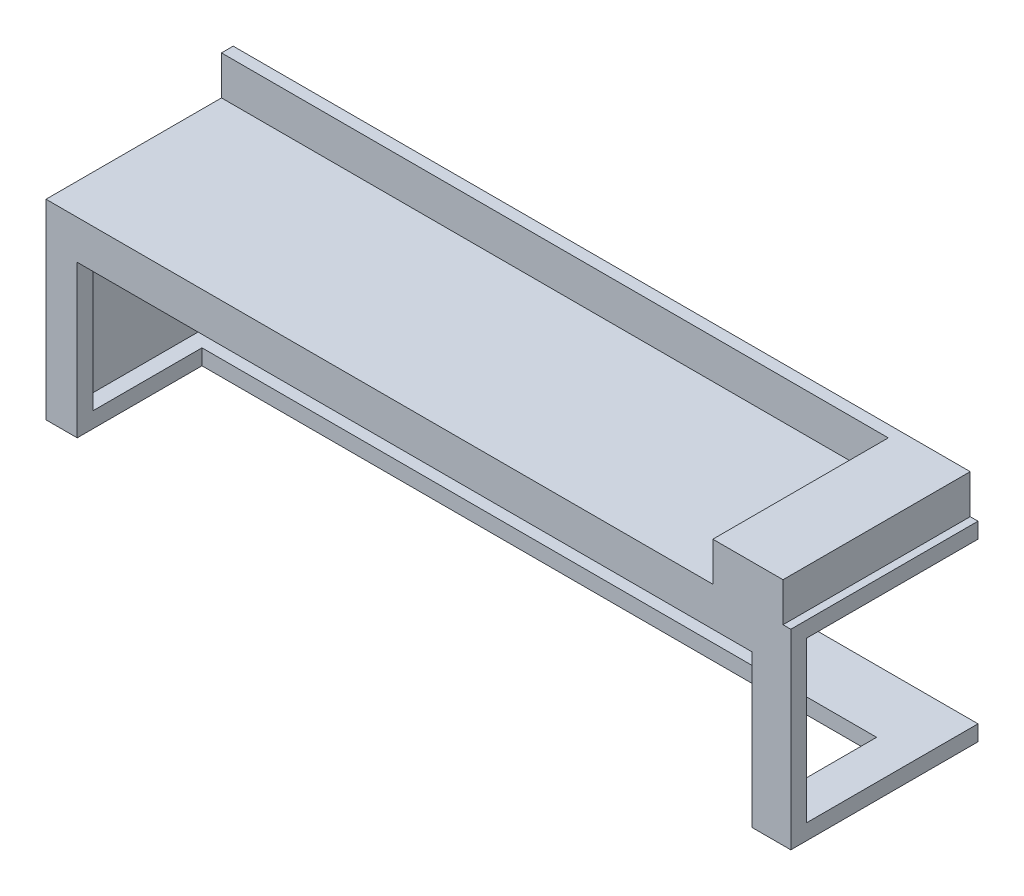
ISO-10303-21;
HEADER;
FILE_DESCRIPTION(('STEP AP214'),'2;1');
FILE_NAME('part.step','',(''),(''),'','','');
FILE_SCHEMA(('AUTOMOTIVE_DESIGN { 1 0 10303 214 1 1 1 1 }'));
ENDSEC;
DATA;
#1=APPLICATION_CONTEXT('core data for automotive mechanical design processes');
#2=APPLICATION_PROTOCOL_DEFINITION('international standard','automotive_design',2000,#1);
#3=PRODUCT_CONTEXT('',#1,'mechanical');
#4=PRODUCT('Part','Part','',(#3));
#5=PRODUCT_RELATED_PRODUCT_CATEGORY('part','',(#4));
#6=PRODUCT_DEFINITION_FORMATION('','',#4);
#7=PRODUCT_DEFINITION_CONTEXT('part definition',#1,'design');
#8=PRODUCT_DEFINITION('design','',#6,#7);
#9=PRODUCT_DEFINITION_SHAPE('','',#8);
#10=(LENGTH_UNIT() NAMED_UNIT(*) SI_UNIT(.MILLI.,.METRE.));
#11=(NAMED_UNIT(*) PLANE_ANGLE_UNIT() SI_UNIT($,.RADIAN.));
#12=(NAMED_UNIT(*) SI_UNIT($,.STERADIAN.) SOLID_ANGLE_UNIT());
#13=UNCERTAINTY_MEASURE_WITH_UNIT(LENGTH_MEASURE(1.E-05),#10,'distance_accuracy_value','');
#14=(GEOMETRIC_REPRESENTATION_CONTEXT(3) GLOBAL_UNCERTAINTY_ASSIGNED_CONTEXT((#13)) GLOBAL_UNIT_ASSIGNED_CONTEXT((#10,
#11,#12)) REPRESENTATION_CONTEXT('',''));
#15=CARTESIAN_POINT('',(0.,0.,0.));
#16=DIRECTION('',(0.,0.,1.));
#17=DIRECTION('',(1.,0.,0.));
#18=AXIS2_PLACEMENT_3D('',#15,#16,#17);
#19=CARTESIAN_POINT('',(35.75,12.25,8.));
#20=DIRECTION('',(1.,0.,0.));
#21=DIRECTION('',(0.,0.,-1.));
#22=AXIS2_PLACEMENT_3D('',#19,#20,#21);
#23=PLANE('',#22);
#24=DIRECTION('',(0.,-1.,0.));
#25=VECTOR('',#24,1.);
#26=CARTESIAN_POINT('',(35.75,17.25,1.5));
#27=LINE('',#26,#25);
#28=CARTESIAN_POINT('',(35.75,17.25,1.5));
#29=VERTEX_POINT('',#28);
#30=CARTESIAN_POINT('',(35.75,12.25,1.5));
#31=VERTEX_POINT('',#30);
#32=EDGE_CURVE('E200',#29,#31,#27,.T.);
#33=ORIENTED_EDGE('',*,*,#32,.T.);
#34=DIRECTION('',(0.,0.,-1.));
#35=VECTOR('',#34,1.);
#36=CARTESIAN_POINT('',(35.75,12.25,8.));
#37=LINE('',#36,#35);
#38=CARTESIAN_POINT('',(35.75,12.25,24.));
#39=VERTEX_POINT('',#38);
#40=EDGE_CURVE('E354',#39,#31,#37,.T.);
#41=ORIENTED_EDGE('',*,*,#40,.F.);
#42=DIRECTION('',(0.,-1.,0.));
#43=VECTOR('',#42,1.);
#44=CARTESIAN_POINT('',(35.75,0.,24.));
#45=LINE('',#44,#43);
#46=CARTESIAN_POINT('',(35.75,17.25,24.));
#47=VERTEX_POINT('',#46);
#48=EDGE_CURVE('E242',#47,#39,#45,.T.);
#49=ORIENTED_EDGE('',*,*,#48,.F.);
#50=DIRECTION('',(0.,0.,-1.));
#51=VECTOR('',#50,1.);
#52=CARTESIAN_POINT('',(35.75,17.25,8.));
#53=LINE('',#52,#51);
#54=EDGE_CURVE('E352',#47,#29,#53,.T.);
#55=ORIENTED_EDGE('',*,*,#54,.T.);
#56=EDGE_LOOP('',(#33,#41,#49,#55));
#57=FACE_BOUND('',#56,.T.);
#58=ADVANCED_FACE('F37',(#57),#23,.F.);
#59=CARTESIAN_POINT('',(35.75,12.25,8.));
#60=DIRECTION('',(0.,-1.,0.));
#61=DIRECTION('',(1.,0.,0.));
#62=AXIS2_PLACEMENT_3D('',#59,#60,#61);
#63=PLANE('',#62);
#64=DIRECTION('',(1.,0.,0.));
#65=VECTOR('',#64,1.);
#66=CARTESIAN_POINT('',(-49.75,12.25,1.5));
#67=LINE('',#66,#65);
#68=CARTESIAN_POINT('',(-49.75,12.25,1.5));
#69=VERTEX_POINT('',#68);
#70=EDGE_CURVE('E212',#69,#31,#67,.T.);
#71=ORIENTED_EDGE('',*,*,#70,.F.);
#72=DIRECTION('',(0.,0.,-1.));
#73=VECTOR('',#72,1.);
#74=CARTESIAN_POINT('',(-49.75,12.25,8.));
#75=LINE('',#74,#73);
#76=CARTESIAN_POINT('',(-49.75,12.25,24.));
#77=VERTEX_POINT('',#76);
#78=EDGE_CURVE('E217',#77,#69,#75,.T.);
#79=ORIENTED_EDGE('',*,*,#78,.F.);
#80=DIRECTION('',(-1.,0.,0.));
#81=VECTOR('',#80,1.);
#82=CARTESIAN_POINT('',(0.,12.25,24.));
#83=LINE('',#82,#81);
#84=EDGE_CURVE('E245',#39,#77,#83,.T.);
#85=ORIENTED_EDGE('',*,*,#84,.F.);
#86=ORIENTED_EDGE('',*,*,#40,.T.);
#87=EDGE_LOOP('',(#71,#79,#85,#86));
#88=FACE_BOUND('',#87,.T.);
#89=ADVANCED_FACE('F423',(#88),#63,.F.);
#90=CARTESIAN_POINT('',(0.,0.,8.));
#91=DIRECTION('',(0.,0.,-1.));
#92=DIRECTION('',(-1.,0.,0.));
#93=AXIS2_PLACEMENT_3D('',#90,#91,#92);
#94=PLANE('',#93);
#95=DIRECTION('',(0.,-1.,0.));
#96=VECTOR('',#95,1.);
#97=CARTESIAN_POINT('',(40.75,-12.25,8.));
#98=LINE('',#97,#96);
#99=CARTESIAN_POINT('',(40.75,-10.25,8.));
#100=VERTEX_POINT('',#99);
#101=CARTESIAN_POINT('',(40.75,-12.25,8.));
#102=VERTEX_POINT('',#101);
#103=EDGE_CURVE('E273',#100,#102,#98,.T.);
#104=ORIENTED_EDGE('',*,*,#103,.F.);
#105=DIRECTION('',(-1.,0.,0.));
#106=VECTOR('',#105,1.);
#107=CARTESIAN_POINT('',(47.75,-10.25,8.));
#108=LINE('',#107,#106);
#109=CARTESIAN_POINT('',(-45.75,-10.25,8.));
#110=VERTEX_POINT('',#109);
#111=EDGE_CURVE('E41',#100,#110,#108,.T.);
#112=ORIENTED_EDGE('',*,*,#111,.T.);
#113=DIRECTION('',(0.,1.,0.));
#114=VECTOR('',#113,1.);
#115=CARTESIAN_POINT('',(-45.75,-12.25,8.));
#116=LINE('',#115,#114);
#117=CARTESIAN_POINT('',(-45.75,-12.25,8.));
#118=VERTEX_POINT('',#117);
#119=EDGE_CURVE('E55',#118,#110,#116,.T.);
#120=ORIENTED_EDGE('',*,*,#119,.F.);
#121=DIRECTION('',(1.,0.,0.));
#122=VECTOR('',#121,1.);
#123=CARTESIAN_POINT('',(47.75,-12.25,8.));
#124=LINE('',#123,#122);
#125=EDGE_CURVE('E328',#118,#102,#124,.T.);
#126=ORIENTED_EDGE('',*,*,#125,.T.);
#127=EDGE_LOOP('',(#104,#112,#120,#126));
#128=FACE_BOUND('',#127,.T.);
#129=ADVANCED_FACE('F438',(#128),#94,.F.);
#130=CARTESIAN_POINT('',(-47.75,-10.25,8.));
#131=DIRECTION('',(-1.,0.,0.));
#132=DIRECTION('',(0.,0.,1.));
#133=AXIS2_PLACEMENT_3D('',#130,#131,#132);
#134=PLANE('',#133);
#135=DIRECTION('',(0.,-1.,0.));
#136=VECTOR('',#135,1.);
#137=CARTESIAN_POINT('',(-47.75,0.,22.));
#138=LINE('',#137,#136);
#139=CARTESIAN_POINT('',(-47.75,10.25,22.));
#140=VERTEX_POINT('',#139);
#141=CARTESIAN_POINT('',(-47.75,-10.25,22.));
#142=VERTEX_POINT('',#141);
#143=EDGE_CURVE('E306',#140,#142,#138,.T.);
#144=ORIENTED_EDGE('',*,*,#143,.T.);
#145=DIRECTION('',(0.,0.,-1.));
#146=VECTOR('',#145,1.);
#147=CARTESIAN_POINT('',(-47.75,-10.25,8.));
#148=LINE('',#147,#146);
#149=CARTESIAN_POINT('',(-47.75,-10.25,0.));
#150=VERTEX_POINT('',#149);
#151=EDGE_CURVE('E333',#142,#150,#148,.T.);
#152=ORIENTED_EDGE('',*,*,#151,.T.);
#153=DIRECTION('',(0.,1.,0.));
#154=VECTOR('',#153,1.);
#155=CARTESIAN_POINT('',(-47.75,-10.25,0.));
#156=LINE('',#155,#154);
#157=CARTESIAN_POINT('',(-47.75,10.25,0.));
#158=VERTEX_POINT('',#157);
#159=EDGE_CURVE('E330',#150,#158,#156,.T.);
#160=ORIENTED_EDGE('',*,*,#159,.T.);
#161=DIRECTION('',(0.,0.,-1.));
#162=VECTOR('',#161,1.);
#163=CARTESIAN_POINT('',(-47.75,10.25,8.));
#164=LINE('',#163,#162);
#165=EDGE_CURVE('E336',#140,#158,#164,.T.);
#166=ORIENTED_EDGE('',*,*,#165,.F.);
#167=EDGE_LOOP('',(#144,#152,#160,#166));
#168=FACE_BOUND('',#167,.T.);
#169=ADVANCED_FACE('F403',(#168),#134,.F.);
#170=CARTESIAN_POINT('',(47.75,10.25,8.));
#171=DIRECTION('',(0.,1.,0.));
#172=DIRECTION('',(0.,0.,1.));
#173=AXIS2_PLACEMENT_3D('',#170,#171,#172);
#174=PLANE('',#173);
#175=DIRECTION('',(0.,0.,-1.));
#176=VECTOR('',#175,1.);
#177=CARTESIAN_POINT('',(45.75,10.25,8.));
#178=LINE('',#177,#176);
#179=CARTESIAN_POINT('',(45.75,10.25,22.));
#180=VERTEX_POINT('',#179);
#181=CARTESIAN_POINT('',(45.75,10.25,0.));
#182=VERTEX_POINT('',#181);
#183=EDGE_CURVE('E298',#180,#182,#178,.T.);
#184=ORIENTED_EDGE('',*,*,#183,.F.);
#185=DIRECTION('',(1.,0.,0.));
#186=VECTOR('',#185,1.);
#187=CARTESIAN_POINT('',(0.,10.25,22.));
#188=LINE('',#187,#186);
#189=CARTESIAN_POINT('',(41.75,10.25,22.));
#190=VERTEX_POINT('',#189);
#191=EDGE_CURVE('E321',#190,#180,#188,.T.);
#192=ORIENTED_EDGE('',*,*,#191,.F.);
#193=DIRECTION('',(0.,0.,-1.));
#194=VECTOR('',#193,1.);
#195=CARTESIAN_POINT('',(41.75,10.25,8.));
#196=LINE('',#195,#194);
#197=CARTESIAN_POINT('',(41.75,10.25,0.));
#198=VERTEX_POINT('',#197);
#199=EDGE_CURVE('E344',#190,#198,#196,.T.);
#200=ORIENTED_EDGE('',*,*,#199,.T.);
#201=DIRECTION('',(1.,0.,0.));
#202=VECTOR('',#201,1.);
#203=CARTESIAN_POINT('',(47.75,10.25,0.));
#204=LINE('',#203,#202);
#205=EDGE_CURVE('E375',#198,#182,#204,.T.);
#206=ORIENTED_EDGE('',*,*,#205,.T.);
#207=EDGE_LOOP('',(#184,#192,#200,#206));
#208=FACE_BOUND('',#207,.T.);
#209=ADVANCED_FACE('F472',(#208),#174,.F.);
#210=CARTESIAN_POINT('',(47.75,12.25,8.));
#211=DIRECTION('',(0.,-1.,0.));
#212=DIRECTION('',(1.,0.,0.));
#213=AXIS2_PLACEMENT_3D('',#210,#211,#212);
#214=PLANE('',#213);
#215=DIRECTION('',(0.,0.,-1.));
#216=VECTOR('',#215,1.);
#217=CARTESIAN_POINT('',(45.75,12.25,22.000025));
#218=LINE('',#217,#216);
#219=CARTESIAN_POINT('',(45.75,12.25,24.));
#220=VERTEX_POINT('',#219);
#221=CARTESIAN_POINT('',(45.75,12.25,0.));
#222=VERTEX_POINT('',#221);
#223=EDGE_CURVE('E295',#220,#222,#218,.T.);
#224=ORIENTED_EDGE('',*,*,#223,.T.);
#225=DIRECTION('',(-1.,0.,0.));
#226=VECTOR('',#225,1.);
#227=CARTESIAN_POINT('',(47.75,12.25,0.));
#228=LINE('',#227,#226);
#229=CARTESIAN_POINT('',(44.75,12.25,0.));
#230=VERTEX_POINT('',#229);
#231=EDGE_CURVE('E373',#222,#230,#228,.T.);
#232=ORIENTED_EDGE('',*,*,#231,.T.);
#233=DIRECTION('',(0.,0.,-1.));
#234=VECTOR('',#233,1.);
#235=CARTESIAN_POINT('',(44.75,12.25,8.));
#236=LINE('',#235,#234);
#237=CARTESIAN_POINT('',(44.75,12.25,24.));
#238=VERTEX_POINT('',#237);
#239=EDGE_CURVE('E347',#238,#230,#236,.T.);
#240=ORIENTED_EDGE('',*,*,#239,.F.);
#241=DIRECTION('',(-1.,0.,0.));
#242=VECTOR('',#241,1.);
#243=CARTESIAN_POINT('',(0.,12.25,24.));
#244=LINE('',#243,#242);
#245=EDGE_CURVE('E233',#220,#238,#244,.T.);
#246=ORIENTED_EDGE('',*,*,#245,.F.);
#247=EDGE_LOOP('',(#224,#232,#240,#246));
#248=FACE_BOUND('',#247,.T.);
#249=ADVANCED_FACE('F433',(#248),#214,.F.);
#250=CARTESIAN_POINT('',(47.75,-12.25,8.));
#251=DIRECTION('',(0.,1.,0.));
#252=DIRECTION('',(-1.,0.,0.));
#253=AXIS2_PLACEMENT_3D('',#250,#251,#252);
#254=PLANE('',#253);
#255=ORIENTED_EDGE('',*,*,#125,.F.);
#256=DIRECTION('',(0.,0.,-1.));
#257=VECTOR('',#256,1.);
#258=CARTESIAN_POINT('',(-45.75,-12.25,22.));
#259=LINE('',#258,#257);
#260=CARTESIAN_POINT('',(-45.75,-12.25,24.));
#261=VERTEX_POINT('',#260);
#262=EDGE_CURVE('E290',#261,#118,#259,.T.);
#263=ORIENTED_EDGE('',*,*,#262,.F.);
#264=DIRECTION('',(1.,0.,0.));
#265=VECTOR('',#264,1.);
#266=CARTESIAN_POINT('',(0.,-12.25,24.));
#267=LINE('',#266,#265);
#268=CARTESIAN_POINT('',(-49.75,-12.25,24.));
#269=VERTEX_POINT('',#268);
#270=EDGE_CURVE('E251',#269,#261,#267,.T.);
#271=ORIENTED_EDGE('',*,*,#270,.F.);
#272=DIRECTION('',(0.,0.,-1.));
#273=VECTOR('',#272,1.);
#274=CARTESIAN_POINT('',(-49.75,-12.25,8.));
#275=LINE('',#274,#273);
#276=CARTESIAN_POINT('',(-49.75,-12.25,0.));
#277=VERTEX_POINT('',#276);
#278=EDGE_CURVE('E335',#269,#277,#275,.T.);
#279=ORIENTED_EDGE('',*,*,#278,.T.);
#280=DIRECTION('',(1.,0.,0.));
#281=VECTOR('',#280,1.);
#282=CARTESIAN_POINT('',(47.75,-12.25,0.));
#283=LINE('',#282,#281);
#284=CARTESIAN_POINT('',(45.75,-12.25,0.));
#285=VERTEX_POINT('',#284);
#286=EDGE_CURVE('E365',#277,#285,#283,.T.);
#287=ORIENTED_EDGE('',*,*,#286,.T.);
#288=DIRECTION('',(0.,0.,-1.));
#289=VECTOR('',#288,1.);
#290=CARTESIAN_POINT('',(45.75,-12.25,22.000025));
#291=LINE('',#290,#289);
#292=CARTESIAN_POINT('',(45.75,-12.25,24.));
#293=VERTEX_POINT('',#292);
#294=EDGE_CURVE('E293',#293,#285,#291,.T.);
#295=ORIENTED_EDGE('',*,*,#294,.F.);
#296=DIRECTION('',(-1.,0.,0.));
#297=VECTOR('',#296,1.);
#298=CARTESIAN_POINT('',(0.,-12.25,24.));
#299=LINE('',#298,#297);
#300=CARTESIAN_POINT('',(40.75,-12.25,24.));
#301=VERTEX_POINT('',#300);
#302=EDGE_CURVE('E226',#293,#301,#299,.T.);
#303=ORIENTED_EDGE('',*,*,#302,.T.);
#304=DIRECTION('',(0.,0.,-1.));
#305=VECTOR('',#304,1.);
#306=CARTESIAN_POINT('',(40.75,-12.25,22.));
#307=LINE('',#306,#305);
#308=EDGE_CURVE('E277',#301,#102,#307,.T.);
#309=ORIENTED_EDGE('',*,*,#308,.T.);
#310=EDGE_LOOP('',(#255,#263,#271,#279,#287,#295,#303,#309));
#311=FACE_BOUND('',#310,.T.);
#312=ADVANCED_FACE('F413',(#311),#254,.F.);
#313=CARTESIAN_POINT('',(47.75,-10.25,8.));
#314=DIRECTION('',(0.,-1.,0.));
#315=DIRECTION('',(1.,0.,0.));
#316=AXIS2_PLACEMENT_3D('',#313,#314,#315);
#317=PLANE('',#316);
#318=DIRECTION('',(0.,0.,1.));
#319=VECTOR('',#318,1.);
#320=CARTESIAN_POINT('',(45.75,-10.25,8.));
#321=LINE('',#320,#319);
#322=CARTESIAN_POINT('',(45.75,-10.25,0.));
#323=VERTEX_POINT('',#322);
#324=CARTESIAN_POINT('',(45.75,-10.25,22.));
#325=VERTEX_POINT('',#324);
#326=EDGE_CURVE('E304',#323,#325,#321,.T.);
#327=ORIENTED_EDGE('',*,*,#326,.F.);
#328=DIRECTION('',(-1.,0.,0.));
#329=VECTOR('',#328,1.);
#330=CARTESIAN_POINT('',(47.75,-10.25,0.));
#331=LINE('',#330,#329);
#332=EDGE_CURVE('E363',#323,#150,#331,.T.);
#333=ORIENTED_EDGE('',*,*,#332,.T.);
#334=ORIENTED_EDGE('',*,*,#151,.F.);
#335=DIRECTION('',(-1.,0.,0.));
#336=VECTOR('',#335,1.);
#337=CARTESIAN_POINT('',(-47.75,-10.25,22.));
#338=LINE('',#337,#336);
#339=CARTESIAN_POINT('',(-45.75,-10.25,22.));
#340=VERTEX_POINT('',#339);
#341=EDGE_CURVE('E283',#340,#142,#338,.T.);
#342=ORIENTED_EDGE('',*,*,#341,.F.);
#343=DIRECTION('',(0.,0.,-1.));
#344=VECTOR('',#343,1.);
#345=CARTESIAN_POINT('',(-45.75,-10.25,22.));
#346=LINE('',#345,#344);
#347=EDGE_CURVE('E286',#340,#110,#346,.T.);
#348=ORIENTED_EDGE('',*,*,#347,.T.);
#349=ORIENTED_EDGE('',*,*,#111,.F.);
#350=DIRECTION('',(0.,0.,-1.));
#351=VECTOR('',#350,1.);
#352=CARTESIAN_POINT('',(40.75,-10.25,22.));
#353=LINE('',#352,#351);
#354=CARTESIAN_POINT('',(40.75,-10.25,22.));
#355=VERTEX_POINT('',#354);
#356=EDGE_CURVE('E281',#355,#100,#353,.T.);
#357=ORIENTED_EDGE('',*,*,#356,.F.);
#358=DIRECTION('',(-1.,0.,0.));
#359=VECTOR('',#358,1.);
#360=CARTESIAN_POINT('',(45.75,-10.25,22.));
#361=LINE('',#360,#359);
#362=EDGE_CURVE('E274',#325,#355,#361,.T.);
#363=ORIENTED_EDGE('',*,*,#362,.F.);
#364=EDGE_LOOP('',(#327,#333,#334,#342,#348,#349,#357,#363));
#365=FACE_BOUND('',#364,.T.);
#366=ADVANCED_FACE('F406',(#365),#317,.F.);
#367=CARTESIAN_POINT('',(0.,0.,0.));
#368=DIRECTION('',(0.,0.,-1.));
#369=DIRECTION('',(-1.,0.,0.));
#370=AXIS2_PLACEMENT_3D('',#367,#368,#369);
#371=PLANE('',#370);
#372=ORIENTED_EDGE('',*,*,#231,.F.);
#373=DIRECTION('',(0.,-1.,0.));
#374=VECTOR('',#373,1.);
#375=CARTESIAN_POINT('',(45.75,0.,0.));
#376=LINE('',#375,#374);
#377=EDGE_CURVE('E300',#222,#182,#376,.T.);
#378=ORIENTED_EDGE('',*,*,#377,.T.);
#379=ORIENTED_EDGE('',*,*,#205,.F.);
#380=DIRECTION('',(0.,-1.,0.));
#381=VECTOR('',#380,1.);
#382=CARTESIAN_POINT('',(41.75,10.25,0.));
#383=LINE('',#382,#381);
#384=CARTESIAN_POINT('',(41.75,15.25,0.));
#385=VERTEX_POINT('',#384);
#386=EDGE_CURVE('E378',#385,#198,#383,.T.);
#387=ORIENTED_EDGE('',*,*,#386,.F.);
#388=DIRECTION('',(1.,0.,0.));
#389=VECTOR('',#388,1.);
#390=CARTESIAN_POINT('',(41.75,15.25,0.));
#391=LINE('',#390,#389);
#392=CARTESIAN_POINT('',(38.75,15.25,0.));
#393=VERTEX_POINT('',#392);
#394=EDGE_CURVE('E380',#393,#385,#391,.T.);
#395=ORIENTED_EDGE('',*,*,#394,.F.);
#396=DIRECTION('',(0.,1.,0.));
#397=VECTOR('',#396,1.);
#398=CARTESIAN_POINT('',(38.75,15.25,0.));
#399=LINE('',#398,#397);
#400=CARTESIAN_POINT('',(38.75,10.25,0.));
#401=VERTEX_POINT('',#400);
#402=EDGE_CURVE('E382',#401,#393,#399,.T.);
#403=ORIENTED_EDGE('',*,*,#402,.F.);
#404=DIRECTION('',(1.,0.,0.));
#405=VECTOR('',#404,1.);
#406=CARTESIAN_POINT('',(38.75,10.25,0.));
#407=LINE('',#406,#405);
#408=EDGE_CURVE('E324',#158,#401,#407,.T.);
#409=ORIENTED_EDGE('',*,*,#408,.F.);
#410=ORIENTED_EDGE('',*,*,#159,.F.);
#411=ORIENTED_EDGE('',*,*,#332,.F.);
#412=EDGE_CURVE('E303',#323,#285,#376,.T.);
#413=ORIENTED_EDGE('',*,*,#412,.T.);
#414=ORIENTED_EDGE('',*,*,#286,.F.);
#415=DIRECTION('',(0.,-1.,0.));
#416=VECTOR('',#415,1.);
#417=CARTESIAN_POINT('',(-49.75,-12.25,0.));
#418=LINE('',#417,#416);
#419=CARTESIAN_POINT('',(-49.75,17.25,0.));
#420=VERTEX_POINT('',#419);
#421=EDGE_CURVE('E368',#420,#277,#418,.T.);
#422=ORIENTED_EDGE('',*,*,#421,.F.);
#423=DIRECTION('',(-1.,0.,0.));
#424=VECTOR('',#423,1.);
#425=CARTESIAN_POINT('',(35.75,17.25,0.));
#426=LINE('',#425,#424);
#427=CARTESIAN_POINT('',(44.75,17.25,0.));
#428=VERTEX_POINT('',#427);
#429=EDGE_CURVE('E209',#428,#420,#426,.T.);
#430=ORIENTED_EDGE('',*,*,#429,.F.);
#431=DIRECTION('',(0.,1.,0.));
#432=VECTOR('',#431,1.);
#433=CARTESIAN_POINT('',(44.75,12.25,0.));
#434=LINE('',#433,#432);
#435=EDGE_CURVE('E371',#230,#428,#434,.T.);
#436=ORIENTED_EDGE('',*,*,#435,.F.);
#437=EDGE_LOOP('',(#372,#378,#379,#387,#395,#403,#409,#410,#411,#413,#414,#422,#430,#436));
#438=FACE_BOUND('',#437,.T.);
#439=ADVANCED_FACE('F392',(#438),#371,.T.);
#440=CARTESIAN_POINT('',(38.75,10.25,8.));
#441=DIRECTION('',(0.,1.,0.));
#442=DIRECTION('',(-1.,0.,0.));
#443=AXIS2_PLACEMENT_3D('',#440,#441,#442);
#444=PLANE('',#443);
#445=ORIENTED_EDGE('',*,*,#408,.T.);
#446=DIRECTION('',(0.,0.,-1.));
#447=VECTOR('',#446,1.);
#448=CARTESIAN_POINT('',(38.75,10.25,8.));
#449=LINE('',#448,#447);
#450=CARTESIAN_POINT('',(38.75,10.25,22.));
#451=VERTEX_POINT('',#450);
#452=EDGE_CURVE('E11',#451,#401,#449,.T.);
#453=ORIENTED_EDGE('',*,*,#452,.F.);
#454=DIRECTION('',(1.,0.,0.));
#455=VECTOR('',#454,1.);
#456=CARTESIAN_POINT('',(0.,10.25,22.));
#457=LINE('',#456,#455);
#458=EDGE_CURVE('E309',#140,#451,#457,.T.);
#459=ORIENTED_EDGE('',*,*,#458,.F.);
#460=ORIENTED_EDGE('',*,*,#165,.T.);
#461=EDGE_LOOP('',(#445,#453,#459,#460));
#462=FACE_BOUND('',#461,.T.);
#463=ADVANCED_FACE('F39',(#462),#444,.F.);
#464=CARTESIAN_POINT('',(38.75,15.25,8.));
#465=DIRECTION('',(-1.,0.,0.));
#466=DIRECTION('',(0.,-1.,0.));
#467=AXIS2_PLACEMENT_3D('',#464,#465,#466);
#468=PLANE('',#467);
#469=ORIENTED_EDGE('',*,*,#402,.T.);
#470=DIRECTION('',(0.,0.,-1.));
#471=VECTOR('',#470,1.);
#472=CARTESIAN_POINT('',(38.75,15.25,8.));
#473=LINE('',#472,#471);
#474=CARTESIAN_POINT('',(38.75,15.25,22.));
#475=VERTEX_POINT('',#474);
#476=EDGE_CURVE('E47',#475,#393,#473,.T.);
#477=ORIENTED_EDGE('',*,*,#476,.F.);
#478=DIRECTION('',(0.,1.,0.));
#479=VECTOR('',#478,1.);
#480=CARTESIAN_POINT('',(38.75,0.,22.));
#481=LINE('',#480,#479);
#482=EDGE_CURVE('E312',#451,#475,#481,.T.);
#483=ORIENTED_EDGE('',*,*,#482,.F.);
#484=ORIENTED_EDGE('',*,*,#452,.T.);
#485=EDGE_LOOP('',(#469,#477,#483,#484));
#486=FACE_BOUND('',#485,.T.);
#487=ADVANCED_FACE('F395',(#486),#468,.F.);
#488=CARTESIAN_POINT('',(41.75,15.25,8.));
#489=DIRECTION('',(0.,1.,0.));
#490=DIRECTION('',(0.,0.,1.));
#491=AXIS2_PLACEMENT_3D('',#488,#489,#490);
#492=PLANE('',#491);
#493=ORIENTED_EDGE('',*,*,#394,.T.);
#494=DIRECTION('',(0.,0.,-1.));
#495=VECTOR('',#494,1.);
#496=CARTESIAN_POINT('',(41.75,15.25,8.));
#497=LINE('',#496,#495);
#498=CARTESIAN_POINT('',(41.75,15.25,22.));
#499=VERTEX_POINT('',#498);
#500=EDGE_CURVE('E341',#499,#385,#497,.T.);
#501=ORIENTED_EDGE('',*,*,#500,.F.);
#502=DIRECTION('',(1.,0.,0.));
#503=VECTOR('',#502,1.);
#504=CARTESIAN_POINT('',(0.,15.25,22.));
#505=LINE('',#504,#503);
#506=EDGE_CURVE('E315',#475,#499,#505,.T.);
#507=ORIENTED_EDGE('',*,*,#506,.F.);
#508=ORIENTED_EDGE('',*,*,#476,.T.);
#509=EDGE_LOOP('',(#493,#501,#507,#508));
#510=FACE_BOUND('',#509,.T.);
#511=ADVANCED_FACE('F478',(#510),#492,.F.);
#512=CARTESIAN_POINT('',(41.75,10.25,8.));
#513=DIRECTION('',(1.,0.,0.));
#514=DIRECTION('',(0.,0.,-1.));
#515=AXIS2_PLACEMENT_3D('',#512,#513,#514);
#516=PLANE('',#515);
#517=ORIENTED_EDGE('',*,*,#386,.T.);
#518=ORIENTED_EDGE('',*,*,#199,.F.);
#519=DIRECTION('',(0.,-1.,0.));
#520=VECTOR('',#519,1.);
#521=CARTESIAN_POINT('',(41.75,0.,22.));
#522=LINE('',#521,#520);
#523=EDGE_CURVE('E318',#499,#190,#522,.T.);
#524=ORIENTED_EDGE('',*,*,#523,.F.);
#525=ORIENTED_EDGE('',*,*,#500,.T.);
#526=EDGE_LOOP('',(#517,#518,#524,#525));
#527=FACE_BOUND('',#526,.T.);
#528=ADVANCED_FACE('F469',(#527),#516,.F.);
#529=CARTESIAN_POINT('',(44.75,12.25,8.));
#530=DIRECTION('',(-1.,0.,0.));
#531=DIRECTION('',(0.,0.,1.));
#532=AXIS2_PLACEMENT_3D('',#529,#530,#531);
#533=PLANE('',#532);
#534=ORIENTED_EDGE('',*,*,#435,.T.);
#535=DIRECTION('',(0.,0.,-1.));
#536=VECTOR('',#535,1.);
#537=CARTESIAN_POINT('',(44.75,17.25,8.));
#538=LINE('',#537,#536);
#539=CARTESIAN_POINT('',(44.75,17.25,24.));
#540=VERTEX_POINT('',#539);
#541=EDGE_CURVE('E350',#540,#428,#538,.T.);
#542=ORIENTED_EDGE('',*,*,#541,.F.);
#543=DIRECTION('',(0.,1.,0.));
#544=VECTOR('',#543,1.);
#545=CARTESIAN_POINT('',(44.75,0.,24.));
#546=LINE('',#545,#544);
#547=EDGE_CURVE('E236',#238,#540,#546,.T.);
#548=ORIENTED_EDGE('',*,*,#547,.F.);
#549=ORIENTED_EDGE('',*,*,#239,.T.);
#550=EDGE_LOOP('',(#534,#542,#548,#549));
#551=FACE_BOUND('',#550,.T.);
#552=ADVANCED_FACE('F429',(#551),#533,.F.);
#553=CARTESIAN_POINT('',(35.75,17.25,8.));
#554=DIRECTION('',(0.,-1.,0.));
#555=DIRECTION('',(0.,0.,-1.));
#556=AXIS2_PLACEMENT_3D('',#553,#554,#555);
#557=PLANE('',#556);
#558=ORIENTED_EDGE('',*,*,#429,.T.);
#559=DIRECTION('',(0.,0.,1.));
#560=VECTOR('',#559,1.);
#561=CARTESIAN_POINT('',(-49.75,17.25,0.));
#562=LINE('',#561,#560);
#563=CARTESIAN_POINT('',(-49.75,17.25,1.5));
#564=VERTEX_POINT('',#563);
#565=EDGE_CURVE('E203',#420,#564,#562,.T.);
#566=ORIENTED_EDGE('',*,*,#565,.T.);
#567=DIRECTION('',(1.,0.,0.));
#568=VECTOR('',#567,1.);
#569=CARTESIAN_POINT('',(-49.75,17.25,1.5));
#570=LINE('',#569,#568);
#571=EDGE_CURVE('E193',#564,#29,#570,.T.);
#572=ORIENTED_EDGE('',*,*,#571,.T.);
#573=ORIENTED_EDGE('',*,*,#54,.F.);
#574=DIRECTION('',(-1.,0.,0.));
#575=VECTOR('',#574,1.);
#576=CARTESIAN_POINT('',(0.,17.25,24.));
#577=LINE('',#576,#575);
#578=EDGE_CURVE('E239',#540,#47,#577,.T.);
#579=ORIENTED_EDGE('',*,*,#578,.F.);
#580=ORIENTED_EDGE('',*,*,#541,.T.);
#581=EDGE_LOOP('',(#558,#566,#572,#573,#579,#580));
#582=FACE_BOUND('',#581,.T.);
#583=ADVANCED_FACE('F206',(#582),#557,.F.);
#584=CARTESIAN_POINT('',(-49.75,-12.25,8.));
#585=DIRECTION('',(1.,0.,0.));
#586=DIRECTION('',(0.,0.,-1.));
#587=AXIS2_PLACEMENT_3D('',#584,#585,#586);
#588=PLANE('',#587);
#589=ORIENTED_EDGE('',*,*,#421,.T.);
#590=ORIENTED_EDGE('',*,*,#278,.F.);
#591=DIRECTION('',(0.,-1.,0.));
#592=VECTOR('',#591,1.);
#593=CARTESIAN_POINT('',(-49.75,0.,24.));
#594=LINE('',#593,#592);
#595=EDGE_CURVE('E248',#77,#269,#594,.T.);
#596=ORIENTED_EDGE('',*,*,#595,.F.);
#597=ORIENTED_EDGE('',*,*,#78,.T.);
#598=DIRECTION('',(0.,-1.,0.));
#599=VECTOR('',#598,1.);
#600=CARTESIAN_POINT('',(-49.75,17.25,1.5));
#601=LINE('',#600,#599);
#602=EDGE_CURVE('E197',#564,#69,#601,.T.);
#603=ORIENTED_EDGE('',*,*,#602,.F.);
#604=ORIENTED_EDGE('',*,*,#565,.F.);
#605=EDGE_LOOP('',(#589,#590,#596,#597,#603,#604));
#606=FACE_BOUND('',#605,.T.);
#607=ADVANCED_FACE('F215',(#606),#588,.F.);
#608=CARTESIAN_POINT('',(45.75,-12.25,22.000025));
#609=DIRECTION('',(1.,0.,0.));
#610=DIRECTION('',(0.,0.,-1.));
#611=AXIS2_PLACEMENT_3D('',#608,#609,#610);
#612=PLANE('',#611);
#613=ORIENTED_EDGE('',*,*,#326,.T.);
#614=DIRECTION('',(0.,1.,0.));
#615=VECTOR('',#614,1.);
#616=CARTESIAN_POINT('',(45.75,0.,22.));
#617=LINE('',#616,#615);
#618=EDGE_CURVE('E218',#325,#180,#617,.T.);
#619=ORIENTED_EDGE('',*,*,#618,.T.);
#620=ORIENTED_EDGE('',*,*,#183,.T.);
#621=ORIENTED_EDGE('',*,*,#377,.F.);
#622=ORIENTED_EDGE('',*,*,#223,.F.);
#623=DIRECTION('',(0.,1.,0.));
#624=VECTOR('',#623,1.);
#625=CARTESIAN_POINT('',(45.75,0.,24.));
#626=LINE('',#625,#624);
#627=EDGE_CURVE('E229',#293,#220,#626,.T.);
#628=ORIENTED_EDGE('',*,*,#627,.F.);
#629=ORIENTED_EDGE('',*,*,#294,.T.);
#630=ORIENTED_EDGE('',*,*,#412,.F.);
#631=EDGE_LOOP('',(#613,#619,#620,#621,#622,#628,#629,#630));
#632=FACE_BOUND('',#631,.T.);
#633=ADVANCED_FACE('F434',(#632),#612,.T.);
#634=CARTESIAN_POINT('',(-45.75,-12.25,22.));
#635=DIRECTION('',(-1.,0.,0.));
#636=DIRECTION('',(0.,0.,1.));
#637=AXIS2_PLACEMENT_3D('',#634,#635,#636);
#638=PLANE('',#637);
#639=ORIENTED_EDGE('',*,*,#119,.T.);
#640=ORIENTED_EDGE('',*,*,#347,.F.);
#641=DIRECTION('',(0.,1.,0.));
#642=VECTOR('',#641,1.);
#643=CARTESIAN_POINT('',(-45.75,0.,22.));
#644=LINE('',#643,#642);
#645=CARTESIAN_POINT('',(-45.75,7.25,22.));
#646=VERTEX_POINT('',#645);
#647=EDGE_CURVE('E221',#340,#646,#644,.T.);
#648=ORIENTED_EDGE('',*,*,#647,.T.);
#649=DIRECTION('',(0.,0.,-1.));
#650=VECTOR('',#649,1.);
#651=CARTESIAN_POINT('',(-45.75,7.25,24.));
#652=LINE('',#651,#650);
#653=CARTESIAN_POINT('',(-45.75,7.25,24.));
#654=VERTEX_POINT('',#653);
#655=EDGE_CURVE('E270',#654,#646,#652,.T.);
#656=ORIENTED_EDGE('',*,*,#655,.F.);
#657=DIRECTION('',(0.,1.,0.));
#658=VECTOR('',#657,1.);
#659=CARTESIAN_POINT('',(-45.75,0.,24.));
#660=LINE('',#659,#658);
#661=EDGE_CURVE('E254',#261,#654,#660,.T.);
#662=ORIENTED_EDGE('',*,*,#661,.F.);
#663=ORIENTED_EDGE('',*,*,#262,.T.);
#664=EDGE_LOOP('',(#639,#640,#648,#656,#662,#663));
#665=FACE_BOUND('',#664,.T.);
#666=ADVANCED_FACE('F440',(#665),#638,.F.);
#667=CARTESIAN_POINT('',(40.75,-12.25,22.));
#668=DIRECTION('',(1.,0.,0.));
#669=DIRECTION('',(0.,0.,-1.));
#670=AXIS2_PLACEMENT_3D('',#667,#668,#669);
#671=PLANE('',#670);
#672=ORIENTED_EDGE('',*,*,#103,.T.);
#673=ORIENTED_EDGE('',*,*,#308,.F.);
#674=DIRECTION('',(0.,1.,0.));
#675=VECTOR('',#674,1.);
#676=CARTESIAN_POINT('',(40.75,0.,24.));
#677=LINE('',#676,#675);
#678=CARTESIAN_POINT('',(40.75,7.25,24.));
#679=VERTEX_POINT('',#678);
#680=EDGE_CURVE('E259',#301,#679,#677,.T.);
#681=ORIENTED_EDGE('',*,*,#680,.T.);
#682=DIRECTION('',(0.,0.,-1.));
#683=VECTOR('',#682,1.);
#684=CARTESIAN_POINT('',(40.75,7.25,24.));
#685=LINE('',#684,#683);
#686=CARTESIAN_POINT('',(40.75,7.25,22.));
#687=VERTEX_POINT('',#686);
#688=EDGE_CURVE('E261',#679,#687,#685,.T.);
#689=ORIENTED_EDGE('',*,*,#688,.T.);
#690=DIRECTION('',(0.,1.,0.));
#691=VECTOR('',#690,1.);
#692=CARTESIAN_POINT('',(40.75,0.,22.));
#693=LINE('',#692,#691);
#694=EDGE_CURVE('E230',#355,#687,#693,.T.);
#695=ORIENTED_EDGE('',*,*,#694,.F.);
#696=ORIENTED_EDGE('',*,*,#356,.T.);
#697=EDGE_LOOP('',(#672,#673,#681,#689,#695,#696));
#698=FACE_BOUND('',#697,.T.);
#699=ADVANCED_FACE('F446',(#698),#671,.F.);
#700=CARTESIAN_POINT('',(0.,0.,22.));
#701=DIRECTION('',(0.,0.,1.));
#702=DIRECTION('',(1.,0.,0.));
#703=AXIS2_PLACEMENT_3D('',#700,#701,#702);
#704=PLANE('',#703);
#705=ORIENTED_EDGE('',*,*,#618,.F.);
#706=ORIENTED_EDGE('',*,*,#362,.T.);
#707=ORIENTED_EDGE('',*,*,#694,.T.);
#708=DIRECTION('',(-1.,0.,0.));
#709=VECTOR('',#708,1.);
#710=CARTESIAN_POINT('',(0.,7.25,22.));
#711=LINE('',#710,#709);
#712=EDGE_CURVE('E264',#687,#646,#711,.T.);
#713=ORIENTED_EDGE('',*,*,#712,.T.);
#714=ORIENTED_EDGE('',*,*,#647,.F.);
#715=ORIENTED_EDGE('',*,*,#341,.T.);
#716=ORIENTED_EDGE('',*,*,#143,.F.);
#717=ORIENTED_EDGE('',*,*,#458,.T.);
#718=ORIENTED_EDGE('',*,*,#482,.T.);
#719=ORIENTED_EDGE('',*,*,#506,.T.);
#720=ORIENTED_EDGE('',*,*,#523,.T.);
#721=ORIENTED_EDGE('',*,*,#191,.T.);
#722=EDGE_LOOP('',(#705,#706,#707,#713,#714,#715,#716,#717,#718,#719,#720,#721));
#723=FACE_BOUND('',#722,.T.);
#724=ADVANCED_FACE('F400',(#723),#704,.F.);
#725=CARTESIAN_POINT('',(0.,7.25,24.));
#726=DIRECTION('',(0.,-1.,0.));
#727=DIRECTION('',(1.,0.,0.));
#728=AXIS2_PLACEMENT_3D('',#725,#726,#727);
#729=PLANE('',#728);
#730=ORIENTED_EDGE('',*,*,#712,.F.);
#731=ORIENTED_EDGE('',*,*,#688,.F.);
#732=DIRECTION('',(-1.,0.,0.));
#733=VECTOR('',#732,1.);
#734=CARTESIAN_POINT('',(0.,7.25,24.));
#735=LINE('',#734,#733);
#736=EDGE_CURVE('E256',#679,#654,#735,.T.);
#737=ORIENTED_EDGE('',*,*,#736,.T.);
#738=ORIENTED_EDGE('',*,*,#655,.T.);
#739=EDGE_LOOP('',(#730,#731,#737,#738));
#740=FACE_BOUND('',#739,.T.);
#741=ADVANCED_FACE('F445',(#740),#729,.T.);
#742=CARTESIAN_POINT('',(0.,0.,24.));
#743=DIRECTION('',(0.,0.,1.));
#744=DIRECTION('',(1.,0.,0.));
#745=AXIS2_PLACEMENT_3D('',#742,#743,#744);
#746=PLANE('',#745);
#747=ORIENTED_EDGE('',*,*,#302,.F.);
#748=ORIENTED_EDGE('',*,*,#627,.T.);
#749=ORIENTED_EDGE('',*,*,#245,.T.);
#750=ORIENTED_EDGE('',*,*,#547,.T.);
#751=ORIENTED_EDGE('',*,*,#578,.T.);
#752=ORIENTED_EDGE('',*,*,#48,.T.);
#753=ORIENTED_EDGE('',*,*,#84,.T.);
#754=ORIENTED_EDGE('',*,*,#595,.T.);
#755=ORIENTED_EDGE('',*,*,#270,.T.);
#756=ORIENTED_EDGE('',*,*,#661,.T.);
#757=ORIENTED_EDGE('',*,*,#736,.F.);
#758=ORIENTED_EDGE('',*,*,#680,.F.);
#759=EDGE_LOOP('',(#747,#748,#749,#750,#751,#752,#753,#754,#755,#756,#757,#758));
#760=FACE_BOUND('',#759,.T.);
#761=ADVANCED_FACE('F418',(#760),#746,.T.);
#762=CARTESIAN_POINT('',(-49.75,17.25,1.5));
#763=DIRECTION('',(0.,0.,-1.));
#764=DIRECTION('',(-1.,0.,0.));
#765=AXIS2_PLACEMENT_3D('',#762,#763,#764);
#766=PLANE('',#765);
#767=ORIENTED_EDGE('',*,*,#70,.T.);
#768=ORIENTED_EDGE('',*,*,#32,.F.);
#769=ORIENTED_EDGE('',*,*,#571,.F.);
#770=ORIENTED_EDGE('',*,*,#602,.T.);
#771=EDGE_LOOP('',(#767,#768,#769,#770));
#772=FACE_BOUND('',#771,.T.);
#773=ADVANCED_FACE('F195',(#772),#766,.F.);
#774=CLOSED_SHELL('',(#58,#89,#129,#169,#209,#249,#312,#366,#439,#463,#487,#511,#528,#552,#583,
#607,#633,#666,#699,#724,#741,#761,#773));
#775=MANIFOLD_SOLID_BREP('B2',#774);
#776=ADVANCED_BREP_SHAPE_REPRESENTATION('',(#18,#775),#14);
#777=SHAPE_DEFINITION_REPRESENTATION(#9,#776);
ENDSEC;
END-ISO-10303-21;
